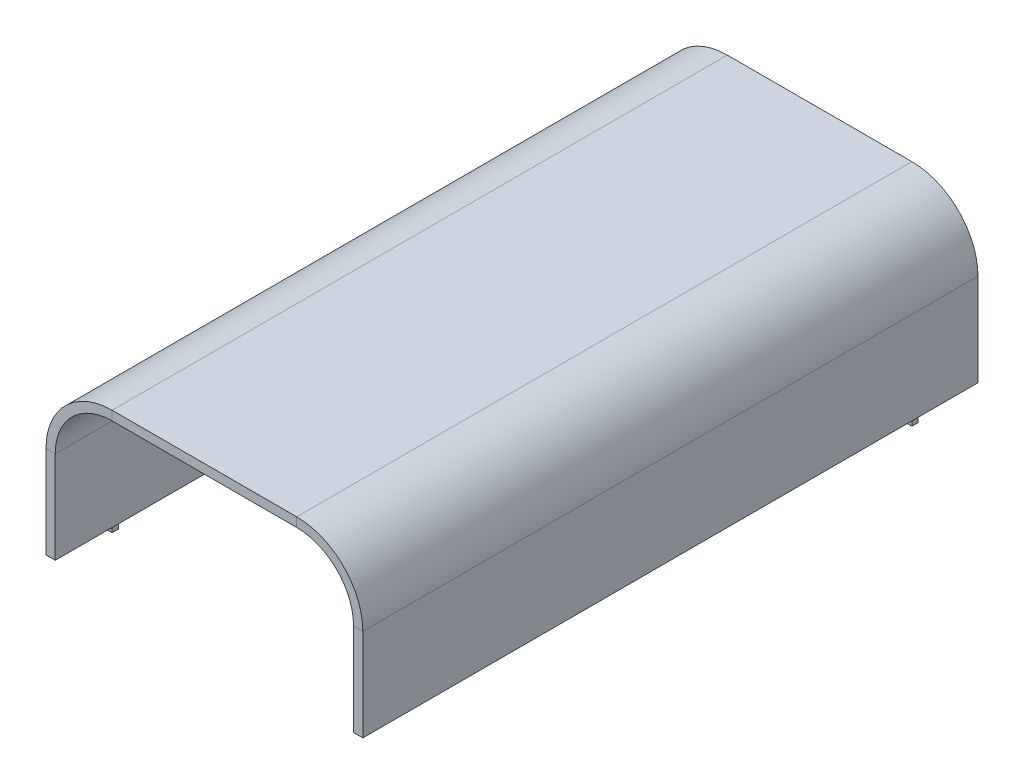
ISO-10303-21;
HEADER;
FILE_DESCRIPTION(('STEP AP214'),'2;1');
FILE_NAME('part.step','',(''),(''),'','','');
FILE_SCHEMA(('AUTOMOTIVE_DESIGN { 1 0 10303 214 1 1 1 1 }'));
ENDSEC;
DATA;
#1=APPLICATION_CONTEXT('core data for automotive mechanical design processes');
#2=APPLICATION_PROTOCOL_DEFINITION('international standard','automotive_design',2000,#1);
#3=PRODUCT_CONTEXT('',#1,'mechanical');
#4=PRODUCT('Part','Part','',(#3));
#5=PRODUCT_RELATED_PRODUCT_CATEGORY('part','',(#4));
#6=PRODUCT_DEFINITION_FORMATION('','',#4);
#7=PRODUCT_DEFINITION_CONTEXT('part definition',#1,'design');
#8=PRODUCT_DEFINITION('design','',#6,#7);
#9=PRODUCT_DEFINITION_SHAPE('','',#8);
#10=(LENGTH_UNIT() NAMED_UNIT(*) SI_UNIT(.MILLI.,.METRE.));
#11=(NAMED_UNIT(*) PLANE_ANGLE_UNIT() SI_UNIT($,.RADIAN.));
#12=(NAMED_UNIT(*) SI_UNIT($,.STERADIAN.) SOLID_ANGLE_UNIT());
#13=UNCERTAINTY_MEASURE_WITH_UNIT(LENGTH_MEASURE(1.E-05),#10,'distance_accuracy_value','');
#14=(GEOMETRIC_REPRESENTATION_CONTEXT(3) GLOBAL_UNCERTAINTY_ASSIGNED_CONTEXT((#13)) GLOBAL_UNIT_ASSIGNED_CONTEXT((#10,
#11,#12)) REPRESENTATION_CONTEXT('',''));
#15=CARTESIAN_POINT('',(0.,0.,0.));
#16=DIRECTION('',(0.,0.,1.));
#17=DIRECTION('',(1.,0.,0.));
#18=AXIS2_PLACEMENT_3D('',#15,#16,#17);
#19=CARTESIAN_POINT('',(0.,0.,0.));
#20=DIRECTION('',(0.,-1.,0.));
#21=DIRECTION('',(0.,0.,-1.));
#22=AXIS2_PLACEMENT_3D('',#19,#20,#21);
#23=PLANE('',#22);
#24=DIRECTION('',(0.,0.,-1.));
#25=VECTOR('',#24,1.);
#26=CARTESIAN_POINT('',(-244.999999999999,0.,-6.80011602582912E-13));
#27=LINE('',#26,#25);
#28=CARTESIAN_POINT('',(-245.,0.,405.));
#29=VERTEX_POINT('',#28);
#30=CARTESIAN_POINT('',(-245.,0.,395.));
#31=VERTEX_POINT('',#30);
#32=EDGE_CURVE('E315',#29,#31,#27,.T.);
#33=ORIENTED_EDGE('',*,*,#32,.T.);
#34=DIRECTION('',(1.,0.,0.));
#35=VECTOR('',#34,1.);
#36=CARTESIAN_POINT('',(0.,0.,395.));
#37=LINE('',#36,#35);
#38=CARTESIAN_POINT('',(-255.,0.,395.));
#39=VERTEX_POINT('',#38);
#40=EDGE_CURVE('E320',#39,#31,#37,.T.);
#41=ORIENTED_EDGE('',*,*,#40,.F.);
#42=DIRECTION('',(0.,0.,-1.));
#43=VECTOR('',#42,1.);
#44=CARTESIAN_POINT('',(-255.,0.,0.));
#45=LINE('',#44,#43);
#46=CARTESIAN_POINT('',(-255.,0.,405.));
#47=VERTEX_POINT('',#46);
#48=EDGE_CURVE('E333',#47,#39,#45,.T.);
#49=ORIENTED_EDGE('',*,*,#48,.F.);
#50=DIRECTION('',(1.,0.,0.));
#51=VECTOR('',#50,1.);
#52=CARTESIAN_POINT('',(0.,0.,405.));
#53=LINE('',#52,#51);
#54=EDGE_CURVE('E330',#47,#29,#53,.T.);
#55=ORIENTED_EDGE('',*,*,#54,.T.);
#56=EDGE_LOOP('',(#33,#41,#49,#55));
#57=FACE_BOUND('',#56,.T.);
#58=DIRECTION('',(0.,0.,-1.));
#59=VECTOR('',#58,1.);
#60=CARTESIAN_POINT('',(-242.5,0.,499.999999999999));
#61=LINE('',#60,#59);
#62=CARTESIAN_POINT('',(-242.5,0.,499.999999999999));
#63=VERTEX_POINT('',#62);
#64=CARTESIAN_POINT('',(-242.5,0.,-500.000000000001));
#65=VERTEX_POINT('',#64);
#66=EDGE_CURVE('E345',#63,#65,#61,.T.);
#67=ORIENTED_EDGE('',*,*,#66,.F.);
#68=DIRECTION('',(1.,0.,0.));
#69=VECTOR('',#68,1.);
#70=CARTESIAN_POINT('',(-257.5,0.,499.999999999999));
#71=LINE('',#70,#69);
#72=CARTESIAN_POINT('',(-257.5,0.,499.999999999999));
#73=VERTEX_POINT('',#72);
#74=EDGE_CURVE('E359',#73,#63,#71,.T.);
#75=ORIENTED_EDGE('',*,*,#74,.F.);
#76=DIRECTION('',(0.,0.,1.));
#77=VECTOR('',#76,1.);
#78=CARTESIAN_POINT('',(-257.5,0.,499.999999999999));
#79=LINE('',#78,#77);
#80=CARTESIAN_POINT('',(-257.5,0.,-500.000000000001));
#81=VERTEX_POINT('',#80);
#82=EDGE_CURVE('E405',#81,#73,#79,.T.);
#83=ORIENTED_EDGE('',*,*,#82,.F.);
#84=DIRECTION('',(-1.,0.,0.));
#85=VECTOR('',#84,1.);
#86=CARTESIAN_POINT('',(-257.5,0.,-500.000000000001));
#87=LINE('',#86,#85);
#88=EDGE_CURVE('E348',#65,#81,#87,.T.);
#89=ORIENTED_EDGE('',*,*,#88,.F.);
#90=EDGE_LOOP('',(#67,#75,#83,#89));
#91=FACE_BOUND('',#90,.T.);
#92=DIRECTION('',(1.,0.,0.));
#93=VECTOR('',#92,1.);
#94=CARTESIAN_POINT('',(0.,0.,-395.));
#95=LINE('',#94,#93);
#96=CARTESIAN_POINT('',(-255.,0.,-395.));
#97=VERTEX_POINT('',#96);
#98=CARTESIAN_POINT('',(-245.,0.,-395.));
#99=VERTEX_POINT('',#98);
#100=EDGE_CURVE('E246',#97,#99,#95,.T.);
#101=ORIENTED_EDGE('',*,*,#100,.T.);
#102=DIRECTION('',(0.,0.,-1.));
#103=VECTOR('',#102,1.);
#104=CARTESIAN_POINT('',(-245.000000000001,0.,-6.80011602582915E-13));
#105=LINE('',#104,#103);
#106=CARTESIAN_POINT('',(-245.,0.,-405.));
#107=VERTEX_POINT('',#106);
#108=EDGE_CURVE('E48',#99,#107,#105,.T.);
#109=ORIENTED_EDGE('',*,*,#108,.T.);
#110=DIRECTION('',(1.,0.,0.));
#111=VECTOR('',#110,1.);
#112=CARTESIAN_POINT('',(0.,0.,-405.));
#113=LINE('',#112,#111);
#114=CARTESIAN_POINT('',(-255.,0.,-405.));
#115=VERTEX_POINT('',#114);
#116=EDGE_CURVE('E237',#115,#107,#113,.T.);
#117=ORIENTED_EDGE('',*,*,#116,.F.);
#118=DIRECTION('',(0.,0.,-1.));
#119=VECTOR('',#118,1.);
#120=CARTESIAN_POINT('',(-255.,0.,0.));
#121=LINE('',#120,#119);
#122=EDGE_CURVE('E240',#97,#115,#121,.T.);
#123=ORIENTED_EDGE('',*,*,#122,.F.);
#124=EDGE_LOOP('',(#101,#109,#117,#123));
#125=FACE_BOUND('',#124,.T.);
#126=ADVANCED_FACE('F34',(#57,#91,#125),#23,.T.);
#127=CARTESIAN_POINT('',(0.,0.,0.));
#128=DIRECTION('',(0.,1.,0.));
#129=DIRECTION('',(0.,0.,-1.));
#130=AXIS2_PLACEMENT_3D('',#127,#128,#129);
#131=PLANE('',#130);
#132=DIRECTION('',(1.,0.,0.));
#133=VECTOR('',#132,1.);
#134=CARTESIAN_POINT('',(245.,0.,395.));
#135=LINE('',#134,#133);
#136=CARTESIAN_POINT('',(245.,0.,395.));
#137=VERTEX_POINT('',#136);
#138=CARTESIAN_POINT('',(255.,0.,395.));
#139=VERTEX_POINT('',#138);
#140=EDGE_CURVE('E272',#137,#139,#135,.T.);
#141=ORIENTED_EDGE('',*,*,#140,.F.);
#142=DIRECTION('',(0.,0.,-1.));
#143=VECTOR('',#142,1.);
#144=CARTESIAN_POINT('',(245.,0.,405.));
#145=LINE('',#144,#143);
#146=CARTESIAN_POINT('',(245.,0.,405.));
#147=VERTEX_POINT('',#146);
#148=EDGE_CURVE('E56',#147,#137,#145,.T.);
#149=ORIENTED_EDGE('',*,*,#148,.F.);
#150=DIRECTION('',(1.,0.,0.));
#151=VECTOR('',#150,1.);
#152=CARTESIAN_POINT('',(245.,0.,405.));
#153=LINE('',#152,#151);
#154=CARTESIAN_POINT('',(255.,0.,405.));
#155=VERTEX_POINT('',#154);
#156=EDGE_CURVE('E265',#147,#155,#153,.T.);
#157=ORIENTED_EDGE('',*,*,#156,.T.);
#158=DIRECTION('',(0.,0.,-1.));
#159=VECTOR('',#158,1.);
#160=CARTESIAN_POINT('',(255.,0.,405.));
#161=LINE('',#160,#159);
#162=EDGE_CURVE('E268',#155,#139,#161,.T.);
#163=ORIENTED_EDGE('',*,*,#162,.T.);
#164=EDGE_LOOP('',(#141,#149,#157,#163));
#165=FACE_BOUND('',#164,.T.);
#166=DIRECTION('',(1.,0.,0.));
#167=VECTOR('',#166,1.);
#168=CARTESIAN_POINT('',(0.,0.,-395.));
#169=LINE('',#168,#167);
#170=CARTESIAN_POINT('',(245.,0.,-395.));
#171=VERTEX_POINT('',#170);
#172=CARTESIAN_POINT('',(255.,0.,-395.));
#173=VERTEX_POINT('',#172);
#174=EDGE_CURVE('E297',#171,#173,#169,.T.);
#175=ORIENTED_EDGE('',*,*,#174,.T.);
#176=DIRECTION('',(0.,0.,-1.));
#177=VECTOR('',#176,1.);
#178=CARTESIAN_POINT('',(255.,0.,0.));
#179=LINE('',#178,#177);
#180=CARTESIAN_POINT('',(255.,0.,-405.));
#181=VERTEX_POINT('',#180);
#182=EDGE_CURVE('E252',#173,#181,#179,.T.);
#183=ORIENTED_EDGE('',*,*,#182,.T.);
#184=DIRECTION('',(1.,0.,0.));
#185=VECTOR('',#184,1.);
#186=CARTESIAN_POINT('',(0.,0.,-405.));
#187=LINE('',#186,#185);
#188=CARTESIAN_POINT('',(245.,0.,-405.));
#189=VERTEX_POINT('',#188);
#190=EDGE_CURVE('E288',#189,#181,#187,.T.);
#191=ORIENTED_EDGE('',*,*,#190,.F.);
#192=DIRECTION('',(0.,0.,-1.));
#193=VECTOR('',#192,1.);
#194=CARTESIAN_POINT('',(245.,0.,0.));
#195=LINE('',#194,#193);
#196=EDGE_CURVE('E299',#171,#189,#195,.T.);
#197=ORIENTED_EDGE('',*,*,#196,.F.);
#198=EDGE_LOOP('',(#175,#183,#191,#197));
#199=FACE_BOUND('',#198,.T.);
#200=DIRECTION('',(0.,0.,-1.));
#201=VECTOR('',#200,1.);
#202=CARTESIAN_POINT('',(242.5,0.,499.999999999999));
#203=LINE('',#202,#201);
#204=CARTESIAN_POINT('',(242.5,0.,499.999999999999));
#205=VERTEX_POINT('',#204);
#206=CARTESIAN_POINT('',(242.5,0.,-500.000000000001));
#207=VERTEX_POINT('',#206);
#208=EDGE_CURVE('E393',#205,#207,#203,.T.);
#209=ORIENTED_EDGE('',*,*,#208,.T.);
#210=DIRECTION('',(1.,0.,0.));
#211=VECTOR('',#210,1.);
#212=CARTESIAN_POINT('',(257.5,0.,-500.000000000001));
#213=LINE('',#212,#211);
#214=CARTESIAN_POINT('',(257.5,0.,-500.000000000001));
#215=VERTEX_POINT('',#214);
#216=EDGE_CURVE('E399',#207,#215,#213,.T.);
#217=ORIENTED_EDGE('',*,*,#216,.T.);
#218=DIRECTION('',(0.,0.,1.));
#219=VECTOR('',#218,1.);
#220=CARTESIAN_POINT('',(257.5,0.,499.999999999999));
#221=LINE('',#220,#219);
#222=CARTESIAN_POINT('',(257.5,0.,499.999999999999));
#223=VERTEX_POINT('',#222);
#224=EDGE_CURVE('E434',#215,#223,#221,.T.);
#225=ORIENTED_EDGE('',*,*,#224,.T.);
#226=DIRECTION('',(-1.,0.,0.));
#227=VECTOR('',#226,1.);
#228=CARTESIAN_POINT('',(257.5,0.,499.999999999999));
#229=LINE('',#228,#227);
#230=EDGE_CURVE('E11',#223,#205,#229,.T.);
#231=ORIENTED_EDGE('',*,*,#230,.T.);
#232=EDGE_LOOP('',(#209,#217,#225,#231));
#233=FACE_BOUND('',#232,.T.);
#234=ADVANCED_FACE('F523',(#165,#199,#233),#131,.F.);
#235=CARTESIAN_POINT('',(-242.5,0.,499.999999999999));
#236=DIRECTION('',(1.,0.,0.));
#237=DIRECTION('',(0.,0.,-1.));
#238=AXIS2_PLACEMENT_3D('',#235,#236,#237);
#239=PLANE('',#238);
#240=DIRECTION('',(0.,1.,0.));
#241=VECTOR('',#240,1.);
#242=CARTESIAN_POINT('',(-242.5,0.,-500.000000000001));
#243=LINE('',#242,#241);
#244=CARTESIAN_POINT('',(-242.5,149.999999999999,-500.000000000001));
#245=VERTEX_POINT('',#244);
#246=EDGE_CURVE('E352',#65,#245,#243,.T.);
#247=ORIENTED_EDGE('',*,*,#246,.T.);
#248=DIRECTION('',(0.,0.,-1.));
#249=VECTOR('',#248,1.);
#250=CARTESIAN_POINT('',(-242.5,149.999999999999,499.999999999999));
#251=LINE('',#250,#249);
#252=CARTESIAN_POINT('',(-242.5,149.999999999999,499.999999999999));
#253=VERTEX_POINT('',#252);
#254=EDGE_CURVE('E349',#253,#245,#251,.T.);
#255=ORIENTED_EDGE('',*,*,#254,.F.);
#256=DIRECTION('',(0.,1.,0.));
#257=VECTOR('',#256,1.);
#258=CARTESIAN_POINT('',(-242.5,0.,499.999999999999));
#259=LINE('',#258,#257);
#260=EDGE_CURVE('E353',#63,#253,#259,.T.);
#261=ORIENTED_EDGE('',*,*,#260,.F.);
#262=ORIENTED_EDGE('',*,*,#66,.T.);
#263=EDGE_LOOP('',(#247,#255,#261,#262));
#264=FACE_BOUND('',#263,.T.);
#265=ADVANCED_FACE('F496',(#264),#239,.T.);
#266=CARTESIAN_POINT('',(-257.5,0.,-500.000000000001));
#267=DIRECTION('',(0.,0.,-1.));
#268=DIRECTION('',(-1.,0.,0.));
#269=AXIS2_PLACEMENT_3D('',#266,#267,#268);
#270=PLANE('',#269);
#271=DIRECTION('',(0.,1.,0.));
#272=VECTOR('',#271,1.);
#273=CARTESIAN_POINT('',(-257.5,0.,-500.000000000001));
#274=LINE('',#273,#272);
#275=CARTESIAN_POINT('',(-257.5,149.999999999999,-500.000000000001));
#276=VERTEX_POINT('',#275);
#277=EDGE_CURVE('E408',#81,#276,#274,.T.);
#278=ORIENTED_EDGE('',*,*,#277,.T.);
#279=DIRECTION('',(-1.,0.,0.));
#280=VECTOR('',#279,1.);
#281=CARTESIAN_POINT('',(-257.5,149.999999999999,-500.000000000001));
#282=LINE('',#281,#280);
#283=EDGE_CURVE('E356',#245,#276,#282,.T.);
#284=ORIENTED_EDGE('',*,*,#283,.F.);
#285=ORIENTED_EDGE('',*,*,#246,.F.);
#286=ORIENTED_EDGE('',*,*,#88,.T.);
#287=EDGE_LOOP('',(#278,#284,#285,#286));
#288=FACE_BOUND('',#287,.T.);
#289=ADVANCED_FACE('F507',(#288),#270,.T.);
#290=CARTESIAN_POINT('',(-257.5,0.,499.999999999999));
#291=DIRECTION('',(-1.,0.,0.));
#292=DIRECTION('',(0.,0.,1.));
#293=AXIS2_PLACEMENT_3D('',#290,#291,#292);
#294=PLANE('',#293);
#295=DIRECTION('',(0.,1.,0.));
#296=VECTOR('',#295,1.);
#297=CARTESIAN_POINT('',(-257.5,0.,499.999999999999));
#298=LINE('',#297,#296);
#299=CARTESIAN_POINT('',(-257.5,149.999999999999,499.999999999999));
#300=VERTEX_POINT('',#299);
#301=EDGE_CURVE('E439',#73,#300,#298,.T.);
#302=ORIENTED_EDGE('',*,*,#301,.T.);
#303=DIRECTION('',(0.,0.,1.));
#304=VECTOR('',#303,1.);
#305=CARTESIAN_POINT('',(-257.5,149.999999999999,499.999999999999));
#306=LINE('',#305,#304);
#307=EDGE_CURVE('E411',#276,#300,#306,.T.);
#308=ORIENTED_EDGE('',*,*,#307,.F.);
#309=ORIENTED_EDGE('',*,*,#277,.F.);
#310=ORIENTED_EDGE('',*,*,#82,.T.);
#311=EDGE_LOOP('',(#302,#308,#309,#310));
#312=FACE_BOUND('',#311,.T.);
#313=ADVANCED_FACE('F503',(#312),#294,.T.);
#314=CARTESIAN_POINT('',(-257.5,0.,499.999999999999));
#315=DIRECTION('',(0.,0.,1.));
#316=DIRECTION('',(1.,0.,0.));
#317=AXIS2_PLACEMENT_3D('',#314,#315,#316);
#318=PLANE('',#317);
#319=DIRECTION('',(1.,0.,0.));
#320=VECTOR('',#319,1.);
#321=CARTESIAN_POINT('',(-257.5,149.999999999999,499.999999999999));
#322=LINE('',#321,#320);
#323=EDGE_CURVE('E370',#300,#253,#322,.T.);
#324=ORIENTED_EDGE('',*,*,#323,.F.);
#325=ORIENTED_EDGE('',*,*,#301,.F.);
#326=ORIENTED_EDGE('',*,*,#74,.T.);
#327=ORIENTED_EDGE('',*,*,#260,.T.);
#328=EDGE_LOOP('',(#324,#325,#326,#327));
#329=FACE_BOUND('',#328,.T.);
#330=ADVANCED_FACE('F498',(#329),#318,.T.);
#331=CARTESIAN_POINT('',(-150.,150.,0.));
#332=DIRECTION('',(0.,0.,-1.));
#333=DIRECTION('',(-1.,0.,0.));
#334=AXIS2_PLACEMENT_3D('',#331,#332,#333);
#335=CYLINDRICAL_SURFACE('',#334,92.5);
#336=CARTESIAN_POINT('',(-150.,150.,-500.000000000001));
#337=DIRECTION('',(0.,0.,-1.));
#338=DIRECTION('',(-1.,0.,0.));
#339=AXIS2_PLACEMENT_3D('',#336,#337,#338);
#340=CIRCLE('',#339,92.5);
#341=CARTESIAN_POINT('',(-149.999999999999,242.5,-500.000000000001));
#342=VERTEX_POINT('',#341);
#343=EDGE_CURVE('E363',#245,#342,#340,.T.);
#344=ORIENTED_EDGE('',*,*,#343,.T.);
#345=DIRECTION('',(0.,0.,-1.));
#346=VECTOR('',#345,1.);
#347=CARTESIAN_POINT('',(-149.999999999999,242.5,499.999999999999));
#348=LINE('',#347,#346);
#349=CARTESIAN_POINT('',(-149.999999999999,242.5,499.999999999999));
#350=VERTEX_POINT('',#349);
#351=EDGE_CURVE('E360',#350,#342,#348,.T.);
#352=ORIENTED_EDGE('',*,*,#351,.F.);
#353=CARTESIAN_POINT('',(-150.,150.,499.999999999999));
#354=DIRECTION('',(0.,0.,-1.));
#355=DIRECTION('',(-1.,0.,0.));
#356=AXIS2_PLACEMENT_3D('',#353,#354,#355);
#357=CIRCLE('',#356,92.5);
#358=EDGE_CURVE('E364',#253,#350,#357,.T.);
#359=ORIENTED_EDGE('',*,*,#358,.F.);
#360=ORIENTED_EDGE('',*,*,#254,.T.);
#361=EDGE_LOOP('',(#344,#352,#359,#360));
#362=FACE_BOUND('',#361,.T.);
#363=ADVANCED_FACE('F488',(#362),#335,.F.);
#364=CARTESIAN_POINT('',(-257.5,150.000000000001,-500.000000000001));
#365=DIRECTION('',(0.,0.,-1.));
#366=DIRECTION('',(-1.,0.,0.));
#367=AXIS2_PLACEMENT_3D('',#364,#365,#366);
#368=PLANE('',#367);
#369=CARTESIAN_POINT('',(-150.,150.,-500.000000000001));
#370=DIRECTION('',(0.,0.,-1.));
#371=DIRECTION('',(-1.,0.,0.));
#372=AXIS2_PLACEMENT_3D('',#369,#370,#371);
#373=CIRCLE('',#372,107.5);
#374=CARTESIAN_POINT('',(-149.999999999999,257.5,-500.000000000001));
#375=VERTEX_POINT('',#374);
#376=EDGE_CURVE('E414',#276,#375,#373,.T.);
#377=ORIENTED_EDGE('',*,*,#376,.T.);
#378=DIRECTION('',(0.,1.,0.));
#379=VECTOR('',#378,1.);
#380=CARTESIAN_POINT('',(-149.999999999999,257.5,-500.000000000001));
#381=LINE('',#380,#379);
#382=EDGE_CURVE('E367',#342,#375,#381,.T.);
#383=ORIENTED_EDGE('',*,*,#382,.F.);
#384=ORIENTED_EDGE('',*,*,#343,.F.);
#385=ORIENTED_EDGE('',*,*,#283,.T.);
#386=EDGE_LOOP('',(#377,#383,#384,#385));
#387=FACE_BOUND('',#386,.T.);
#388=ADVANCED_FACE('F509',(#387),#368,.T.);
#389=CARTESIAN_POINT('',(-150.,150.,0.));
#390=DIRECTION('',(0.,0.,-1.));
#391=DIRECTION('',(-1.,0.,0.));
#392=AXIS2_PLACEMENT_3D('',#389,#390,#391);
#393=CYLINDRICAL_SURFACE('',#392,107.5);
#394=CARTESIAN_POINT('',(-150.,150.,499.999999999999));
#395=DIRECTION('',(0.,0.,-1.));
#396=DIRECTION('',(-1.,0.,0.));
#397=AXIS2_PLACEMENT_3D('',#394,#395,#396);
#398=CIRCLE('',#397,107.5);
#399=CARTESIAN_POINT('',(-149.999999999999,257.5,499.999999999999));
#400=VERTEX_POINT('',#399);
#401=EDGE_CURVE('E444',#300,#400,#398,.T.);
#402=ORIENTED_EDGE('',*,*,#401,.T.);
#403=DIRECTION('',(0.,0.,1.));
#404=VECTOR('',#403,1.);
#405=CARTESIAN_POINT('',(-149.999999999999,257.5,499.999999999999));
#406=LINE('',#405,#404);
#407=EDGE_CURVE('E417',#375,#400,#406,.T.);
#408=ORIENTED_EDGE('',*,*,#407,.F.);
#409=ORIENTED_EDGE('',*,*,#376,.F.);
#410=ORIENTED_EDGE('',*,*,#307,.T.);
#411=EDGE_LOOP('',(#402,#408,#409,#410));
#412=FACE_BOUND('',#411,.T.);
#413=ADVANCED_FACE('F535',(#412),#393,.T.);
#414=CARTESIAN_POINT('',(-257.5,150.000000000001,499.999999999999));
#415=DIRECTION('',(0.,0.,1.));
#416=DIRECTION('',(1.,0.,0.));
#417=AXIS2_PLACEMENT_3D('',#414,#415,#416);
#418=PLANE('',#417);
#419=DIRECTION('',(0.,-1.,0.));
#420=VECTOR('',#419,1.);
#421=CARTESIAN_POINT('',(-149.999999999999,257.5,499.999999999999));
#422=LINE('',#421,#420);
#423=EDGE_CURVE('E381',#400,#350,#422,.T.);
#424=ORIENTED_EDGE('',*,*,#423,.F.);
#425=ORIENTED_EDGE('',*,*,#401,.F.);
#426=ORIENTED_EDGE('',*,*,#323,.T.);
#427=ORIENTED_EDGE('',*,*,#358,.T.);
#428=EDGE_LOOP('',(#424,#425,#426,#427));
#429=FACE_BOUND('',#428,.T.);
#430=ADVANCED_FACE('F489',(#429),#418,.T.);
#431=CARTESIAN_POINT('',(-149.999999999999,242.5,499.999999999999));
#432=DIRECTION('',(0.,-1.,0.));
#433=DIRECTION('',(1.,0.,0.));
#434=AXIS2_PLACEMENT_3D('',#431,#432,#433);
#435=PLANE('',#434);
#436=DIRECTION('',(1.,0.,0.));
#437=VECTOR('',#436,1.);
#438=CARTESIAN_POINT('',(-149.999999999999,242.5,-500.000000000001));
#439=LINE('',#438,#437);
#440=CARTESIAN_POINT('',(149.999999999999,242.5,-500.000000000001));
#441=VERTEX_POINT('',#440);
#442=EDGE_CURVE('E374',#342,#441,#439,.T.);
#443=ORIENTED_EDGE('',*,*,#442,.T.);
#444=DIRECTION('',(0.,0.,-1.));
#445=VECTOR('',#444,1.);
#446=CARTESIAN_POINT('',(149.999999999999,242.5,499.999999999999));
#447=LINE('',#446,#445);
#448=CARTESIAN_POINT('',(149.999999999999,242.5,499.999999999999));
#449=VERTEX_POINT('',#448);
#450=EDGE_CURVE('E371',#449,#441,#447,.T.);
#451=ORIENTED_EDGE('',*,*,#450,.F.);
#452=DIRECTION('',(1.,0.,0.));
#453=VECTOR('',#452,1.);
#454=CARTESIAN_POINT('',(-149.999999999999,242.5,499.999999999999));
#455=LINE('',#454,#453);
#456=EDGE_CURVE('E375',#350,#449,#455,.T.);
#457=ORIENTED_EDGE('',*,*,#456,.F.);
#458=ORIENTED_EDGE('',*,*,#351,.T.);
#459=EDGE_LOOP('',(#443,#451,#457,#458));
#460=FACE_BOUND('',#459,.T.);
#461=ADVANCED_FACE('F482',(#460),#435,.T.);
#462=CARTESIAN_POINT('',(-149.999999999999,257.5,-500.000000000001));
#463=DIRECTION('',(0.,0.,-1.));
#464=DIRECTION('',(-1.,0.,0.));
#465=AXIS2_PLACEMENT_3D('',#462,#463,#464);
#466=PLANE('',#465);
#467=DIRECTION('',(1.,0.,0.));
#468=VECTOR('',#467,1.);
#469=CARTESIAN_POINT('',(-149.999999999999,257.5,-500.000000000001));
#470=LINE('',#469,#468);
#471=CARTESIAN_POINT('',(149.999999999999,257.5,-500.000000000001));
#472=VERTEX_POINT('',#471);
#473=EDGE_CURVE('E420',#375,#472,#470,.T.);
#474=ORIENTED_EDGE('',*,*,#473,.T.);
#475=DIRECTION('',(0.,1.,0.));
#476=VECTOR('',#475,1.);
#477=CARTESIAN_POINT('',(149.999999999999,257.5,-500.000000000001));
#478=LINE('',#477,#476);
#479=EDGE_CURVE('E378',#441,#472,#478,.T.);
#480=ORIENTED_EDGE('',*,*,#479,.F.);
#481=ORIENTED_EDGE('',*,*,#442,.F.);
#482=ORIENTED_EDGE('',*,*,#382,.T.);
#483=EDGE_LOOP('',(#474,#480,#481,#482));
#484=FACE_BOUND('',#483,.T.);
#485=ADVANCED_FACE('F512',(#484),#466,.T.);
#486=CARTESIAN_POINT('',(-149.999999999999,257.5,499.999999999999));
#487=DIRECTION('',(0.,1.,0.));
#488=DIRECTION('',(-1.,0.,0.));
#489=AXIS2_PLACEMENT_3D('',#486,#487,#488);
#490=PLANE('',#489);
#491=DIRECTION('',(1.,0.,0.));
#492=VECTOR('',#491,1.);
#493=CARTESIAN_POINT('',(-149.999999999999,257.5,499.999999999999));
#494=LINE('',#493,#492);
#495=CARTESIAN_POINT('',(149.999999999999,257.5,499.999999999999));
#496=VERTEX_POINT('',#495);
#497=EDGE_CURVE('E449',#400,#496,#494,.T.);
#498=ORIENTED_EDGE('',*,*,#497,.T.);
#499=DIRECTION('',(0.,0.,1.));
#500=VECTOR('',#499,1.);
#501=CARTESIAN_POINT('',(149.999999999999,257.5,499.999999999999));
#502=LINE('',#501,#500);
#503=EDGE_CURVE('E423',#472,#496,#502,.T.);
#504=ORIENTED_EDGE('',*,*,#503,.F.);
#505=ORIENTED_EDGE('',*,*,#473,.F.);
#506=ORIENTED_EDGE('',*,*,#407,.T.);
#507=EDGE_LOOP('',(#498,#504,#505,#506));
#508=FACE_BOUND('',#507,.T.);
#509=ADVANCED_FACE('F532',(#508),#490,.T.);
#510=CARTESIAN_POINT('',(-149.999999999999,257.5,499.999999999999));
#511=DIRECTION('',(0.,0.,1.));
#512=DIRECTION('',(1.,0.,0.));
#513=AXIS2_PLACEMENT_3D('',#510,#511,#512);
#514=PLANE('',#513);
#515=DIRECTION('',(0.,-1.,0.));
#516=VECTOR('',#515,1.);
#517=CARTESIAN_POINT('',(149.999999999999,257.5,499.999999999999));
#518=LINE('',#517,#516);
#519=EDGE_CURVE('E392',#496,#449,#518,.T.);
#520=ORIENTED_EDGE('',*,*,#519,.F.);
#521=ORIENTED_EDGE('',*,*,#497,.F.);
#522=ORIENTED_EDGE('',*,*,#423,.T.);
#523=ORIENTED_EDGE('',*,*,#456,.T.);
#524=EDGE_LOOP('',(#520,#521,#522,#523));
#525=FACE_BOUND('',#524,.T.);
#526=ADVANCED_FACE('F483',(#525),#514,.T.);
#527=CARTESIAN_POINT('',(150.,150.,0.));
#528=DIRECTION('',(0.,0.,-1.));
#529=DIRECTION('',(-1.,0.,0.));
#530=AXIS2_PLACEMENT_3D('',#527,#528,#529);
#531=CYLINDRICAL_SURFACE('',#530,92.5);
#532=CARTESIAN_POINT('',(150.,150.,-500.000000000001));
#533=DIRECTION('',(0.,0.,-1.));
#534=DIRECTION('',(0.,1.,0.));
#535=AXIS2_PLACEMENT_3D('',#532,#533,#534);
#536=CIRCLE('',#535,92.5);
#537=CARTESIAN_POINT('',(242.5,149.999999999999,-500.000000000001));
#538=VERTEX_POINT('',#537);
#539=EDGE_CURVE('E385',#441,#538,#536,.T.);
#540=ORIENTED_EDGE('',*,*,#539,.T.);
#541=DIRECTION('',(0.,0.,-1.));
#542=VECTOR('',#541,1.);
#543=CARTESIAN_POINT('',(242.5,149.999999999999,499.999999999999));
#544=LINE('',#543,#542);
#545=CARTESIAN_POINT('',(242.5,149.999999999999,499.999999999999));
#546=VERTEX_POINT('',#545);
#547=EDGE_CURVE('E382',#546,#538,#544,.T.);
#548=ORIENTED_EDGE('',*,*,#547,.F.);
#549=CARTESIAN_POINT('',(150.,150.,499.999999999999));
#550=DIRECTION('',(0.,0.,-1.));
#551=DIRECTION('',(0.,1.,0.));
#552=AXIS2_PLACEMENT_3D('',#549,#550,#551);
#553=CIRCLE('',#552,92.5);
#554=EDGE_CURVE('E386',#449,#546,#553,.T.);
#555=ORIENTED_EDGE('',*,*,#554,.F.);
#556=ORIENTED_EDGE('',*,*,#450,.T.);
#557=EDGE_LOOP('',(#540,#548,#555,#556));
#558=FACE_BOUND('',#557,.T.);
#559=ADVANCED_FACE('F475',(#558),#531,.F.);
#560=CARTESIAN_POINT('',(149.999999999999,257.5,-500.000000000001));
#561=DIRECTION('',(0.,0.,-1.));
#562=DIRECTION('',(-1.,0.,0.));
#563=AXIS2_PLACEMENT_3D('',#560,#561,#562);
#564=PLANE('',#563);
#565=CARTESIAN_POINT('',(150.,150.,-500.000000000001));
#566=DIRECTION('',(0.,0.,-1.));
#567=DIRECTION('',(0.,1.,0.));
#568=AXIS2_PLACEMENT_3D('',#565,#566,#567);
#569=CIRCLE('',#568,107.5);
#570=CARTESIAN_POINT('',(257.5,149.999999999999,-500.000000000001));
#571=VERTEX_POINT('',#570);
#572=EDGE_CURVE('E426',#472,#571,#569,.T.);
#573=ORIENTED_EDGE('',*,*,#572,.T.);
#574=DIRECTION('',(1.,0.,0.));
#575=VECTOR('',#574,1.);
#576=CARTESIAN_POINT('',(257.5,149.999999999999,-500.000000000001));
#577=LINE('',#576,#575);
#578=EDGE_CURVE('E389',#538,#571,#577,.T.);
#579=ORIENTED_EDGE('',*,*,#578,.F.);
#580=ORIENTED_EDGE('',*,*,#539,.F.);
#581=ORIENTED_EDGE('',*,*,#479,.T.);
#582=EDGE_LOOP('',(#573,#579,#580,#581));
#583=FACE_BOUND('',#582,.T.);
#584=ADVANCED_FACE('F515',(#583),#564,.T.);
#585=CARTESIAN_POINT('',(150.,150.,0.));
#586=DIRECTION('',(0.,0.,-1.));
#587=DIRECTION('',(-1.,0.,0.));
#588=AXIS2_PLACEMENT_3D('',#585,#586,#587);
#589=CYLINDRICAL_SURFACE('',#588,107.5);
#590=CARTESIAN_POINT('',(150.,150.,499.999999999999));
#591=DIRECTION('',(0.,0.,-1.));
#592=DIRECTION('',(0.,1.,0.));
#593=AXIS2_PLACEMENT_3D('',#590,#591,#592);
#594=CIRCLE('',#593,107.5);
#595=CARTESIAN_POINT('',(257.5,149.999999999999,499.999999999999));
#596=VERTEX_POINT('',#595);
#597=EDGE_CURVE('E454',#496,#596,#594,.T.);
#598=ORIENTED_EDGE('',*,*,#597,.T.);
#599=DIRECTION('',(0.,0.,1.));
#600=VECTOR('',#599,1.);
#601=CARTESIAN_POINT('',(257.5,149.999999999999,499.999999999999));
#602=LINE('',#601,#600);
#603=EDGE_CURVE('E429',#571,#596,#602,.T.);
#604=ORIENTED_EDGE('',*,*,#603,.F.);
#605=ORIENTED_EDGE('',*,*,#572,.F.);
#606=ORIENTED_EDGE('',*,*,#503,.T.);
#607=EDGE_LOOP('',(#598,#604,#605,#606));
#608=FACE_BOUND('',#607,.T.);
#609=ADVANCED_FACE('F529',(#608),#589,.T.);
#610=CARTESIAN_POINT('',(149.999999999999,257.5,499.999999999999));
#611=DIRECTION('',(0.,0.,1.));
#612=DIRECTION('',(1.,0.,0.));
#613=AXIS2_PLACEMENT_3D('',#610,#611,#612);
#614=PLANE('',#613);
#615=DIRECTION('',(-1.,0.,0.));
#616=VECTOR('',#615,1.);
#617=CARTESIAN_POINT('',(257.5,149.999999999999,499.999999999999));
#618=LINE('',#617,#616);
#619=EDGE_CURVE('E402',#596,#546,#618,.T.);
#620=ORIENTED_EDGE('',*,*,#619,.F.);
#621=ORIENTED_EDGE('',*,*,#597,.F.);
#622=ORIENTED_EDGE('',*,*,#519,.T.);
#623=ORIENTED_EDGE('',*,*,#554,.T.);
#624=EDGE_LOOP('',(#620,#621,#622,#623));
#625=FACE_BOUND('',#624,.T.);
#626=ADVANCED_FACE('F477',(#625),#614,.T.);
#627=CARTESIAN_POINT('',(242.5,149.999999999999,499.999999999999));
#628=DIRECTION('',(-1.,0.,0.));
#629=DIRECTION('',(0.,-1.,0.));
#630=AXIS2_PLACEMENT_3D('',#627,#628,#629);
#631=PLANE('',#630);
#632=DIRECTION('',(0.,-1.,0.));
#633=VECTOR('',#632,1.);
#634=CARTESIAN_POINT('',(242.5,149.999999999999,-500.000000000001));
#635=LINE('',#634,#633);
#636=EDGE_CURVE('E395',#538,#207,#635,.T.);
#637=ORIENTED_EDGE('',*,*,#636,.T.);
#638=ORIENTED_EDGE('',*,*,#208,.F.);
#639=DIRECTION('',(0.,-1.,0.));
#640=VECTOR('',#639,1.);
#641=CARTESIAN_POINT('',(242.5,149.999999999999,499.999999999999));
#642=LINE('',#641,#640);
#643=EDGE_CURVE('E396',#546,#205,#642,.T.);
#644=ORIENTED_EDGE('',*,*,#643,.F.);
#645=ORIENTED_EDGE('',*,*,#547,.T.);
#646=EDGE_LOOP('',(#637,#638,#644,#645));
#647=FACE_BOUND('',#646,.T.);
#648=ADVANCED_FACE('F521',(#647),#631,.T.);
#649=CARTESIAN_POINT('',(257.5,149.999999999999,-500.000000000001));
#650=DIRECTION('',(0.,0.,-1.));
#651=DIRECTION('',(-1.,0.,0.));
#652=AXIS2_PLACEMENT_3D('',#649,#650,#651);
#653=PLANE('',#652);
#654=DIRECTION('',(0.,-1.,0.));
#655=VECTOR('',#654,1.);
#656=CARTESIAN_POINT('',(257.5,149.999999999999,-500.000000000001));
#657=LINE('',#656,#655);
#658=EDGE_CURVE('E431',#571,#215,#657,.T.);
#659=ORIENTED_EDGE('',*,*,#658,.T.);
#660=ORIENTED_EDGE('',*,*,#216,.F.);
#661=ORIENTED_EDGE('',*,*,#636,.F.);
#662=ORIENTED_EDGE('',*,*,#578,.T.);
#663=EDGE_LOOP('',(#659,#660,#661,#662));
#664=FACE_BOUND('',#663,.T.);
#665=ADVANCED_FACE('F518',(#664),#653,.T.);
#666=CARTESIAN_POINT('',(257.5,149.999999999999,499.999999999999));
#667=DIRECTION('',(1.,0.,0.));
#668=DIRECTION('',(0.,1.,0.));
#669=AXIS2_PLACEMENT_3D('',#666,#667,#668);
#670=PLANE('',#669);
#671=DIRECTION('',(0.,-1.,0.));
#672=VECTOR('',#671,1.);
#673=CARTESIAN_POINT('',(257.5,149.999999999999,499.999999999999));
#674=LINE('',#673,#672);
#675=EDGE_CURVE('E41',#596,#223,#674,.T.);
#676=ORIENTED_EDGE('',*,*,#675,.T.);
#677=ORIENTED_EDGE('',*,*,#224,.F.);
#678=ORIENTED_EDGE('',*,*,#658,.F.);
#679=ORIENTED_EDGE('',*,*,#603,.T.);
#680=EDGE_LOOP('',(#676,#677,#678,#679));
#681=FACE_BOUND('',#680,.T.);
#682=ADVANCED_FACE('F526',(#681),#670,.T.);
#683=CARTESIAN_POINT('',(257.5,149.999999999999,499.999999999999));
#684=DIRECTION('',(0.,0.,1.));
#685=DIRECTION('',(1.,0.,0.));
#686=AXIS2_PLACEMENT_3D('',#683,#684,#685);
#687=PLANE('',#686);
#688=ORIENTED_EDGE('',*,*,#230,.F.);
#689=ORIENTED_EDGE('',*,*,#675,.F.);
#690=ORIENTED_EDGE('',*,*,#619,.T.);
#691=ORIENTED_EDGE('',*,*,#643,.T.);
#692=EDGE_LOOP('',(#688,#689,#690,#691));
#693=FACE_BOUND('',#692,.T.);
#694=ADVANCED_FACE('F472',(#693),#687,.T.);
#695=CARTESIAN_POINT('',(-244.999999999999,-10.,-6.80011602582912E-13));
#696=DIRECTION('',(1.,0.,0.));
#697=DIRECTION('',(0.,0.,-1.));
#698=AXIS2_PLACEMENT_3D('',#695,#696,#697);
#699=PLANE('',#698);
#700=ORIENTED_EDGE('',*,*,#32,.F.);
#701=DIRECTION('',(0.,1.,0.));
#702=VECTOR('',#701,1.);
#703=CARTESIAN_POINT('',(-245.,-10.,405.));
#704=LINE('',#703,#702);
#705=CARTESIAN_POINT('',(-245.,-10.,405.));
#706=VERTEX_POINT('',#705);
#707=EDGE_CURVE('E343',#706,#29,#704,.T.);
#708=ORIENTED_EDGE('',*,*,#707,.F.);
#709=DIRECTION('',(0.,0.,-1.));
#710=VECTOR('',#709,1.);
#711=CARTESIAN_POINT('',(-244.999999999999,-10.,-6.80011602582912E-13));
#712=LINE('',#711,#710);
#713=CARTESIAN_POINT('',(-245.,-10.,395.));
#714=VERTEX_POINT('',#713);
#715=EDGE_CURVE('E316',#706,#714,#712,.T.);
#716=ORIENTED_EDGE('',*,*,#715,.T.);
#717=DIRECTION('',(0.,1.,0.));
#718=VECTOR('',#717,1.);
#719=CARTESIAN_POINT('',(-245.,-10.,395.));
#720=LINE('',#719,#718);
#721=EDGE_CURVE('E327',#714,#31,#720,.T.);
#722=ORIENTED_EDGE('',*,*,#721,.T.);
#723=EDGE_LOOP('',(#700,#708,#716,#722));
#724=FACE_BOUND('',#723,.T.);
#725=ADVANCED_FACE('F552',(#724),#699,.T.);
#726=CARTESIAN_POINT('',(0.,-10.,405.));
#727=DIRECTION('',(0.,0.,1.));
#728=DIRECTION('',(1.,0.,0.));
#729=AXIS2_PLACEMENT_3D('',#726,#727,#728);
#730=PLANE('',#729);
#731=ORIENTED_EDGE('',*,*,#54,.F.);
#732=DIRECTION('',(0.,1.,0.));
#733=VECTOR('',#732,1.);
#734=CARTESIAN_POINT('',(-255.,-10.,405.));
#735=LINE('',#734,#733);
#736=CARTESIAN_POINT('',(-255.,-10.,405.));
#737=VERTEX_POINT('',#736);
#738=EDGE_CURVE('E341',#737,#47,#735,.T.);
#739=ORIENTED_EDGE('',*,*,#738,.F.);
#740=DIRECTION('',(1.,0.,0.));
#741=VECTOR('',#740,1.);
#742=CARTESIAN_POINT('',(0.,-10.,405.));
#743=LINE('',#742,#741);
#744=EDGE_CURVE('E319',#737,#706,#743,.T.);
#745=ORIENTED_EDGE('',*,*,#744,.T.);
#746=ORIENTED_EDGE('',*,*,#707,.T.);
#747=EDGE_LOOP('',(#731,#739,#745,#746));
#748=FACE_BOUND('',#747,.T.);
#749=ADVANCED_FACE('F559',(#748),#730,.T.);
#750=CARTESIAN_POINT('',(-255.,-10.,0.));
#751=DIRECTION('',(1.,0.,0.));
#752=DIRECTION('',(0.,0.,-1.));
#753=AXIS2_PLACEMENT_3D('',#750,#751,#752);
#754=PLANE('',#753);
#755=ORIENTED_EDGE('',*,*,#48,.T.);
#756=DIRECTION('',(0.,1.,0.));
#757=VECTOR('',#756,1.);
#758=CARTESIAN_POINT('',(-255.,-10.,395.));
#759=LINE('',#758,#757);
#760=CARTESIAN_POINT('',(-255.,-10.,395.));
#761=VERTEX_POINT('',#760);
#762=EDGE_CURVE('E339',#761,#39,#759,.T.);
#763=ORIENTED_EDGE('',*,*,#762,.F.);
#764=DIRECTION('',(0.,0.,-1.));
#765=VECTOR('',#764,1.);
#766=CARTESIAN_POINT('',(-255.,-10.,0.));
#767=LINE('',#766,#765);
#768=EDGE_CURVE('E323',#737,#761,#767,.T.);
#769=ORIENTED_EDGE('',*,*,#768,.F.);
#770=ORIENTED_EDGE('',*,*,#738,.T.);
#771=EDGE_LOOP('',(#755,#763,#769,#770));
#772=FACE_BOUND('',#771,.T.);
#773=ADVANCED_FACE('F602',(#772),#754,.F.);
#774=CARTESIAN_POINT('',(0.,-10.,395.));
#775=DIRECTION('',(0.,0.,1.));
#776=DIRECTION('',(1.,0.,0.));
#777=AXIS2_PLACEMENT_3D('',#774,#775,#776);
#778=PLANE('',#777);
#779=ORIENTED_EDGE('',*,*,#40,.T.);
#780=ORIENTED_EDGE('',*,*,#721,.F.);
#781=DIRECTION('',(1.,0.,0.));
#782=VECTOR('',#781,1.);
#783=CARTESIAN_POINT('',(0.,-10.,395.));
#784=LINE('',#783,#782);
#785=EDGE_CURVE('E325',#761,#714,#784,.T.);
#786=ORIENTED_EDGE('',*,*,#785,.F.);
#787=ORIENTED_EDGE('',*,*,#762,.T.);
#788=EDGE_LOOP('',(#779,#780,#786,#787));
#789=FACE_BOUND('',#788,.T.);
#790=ADVANCED_FACE('F606',(#789),#778,.F.);
#791=CARTESIAN_POINT('',(0.,-10.,0.));
#792=DIRECTION('',(0.,-1.,0.));
#793=DIRECTION('',(0.,0.,-1.));
#794=AXIS2_PLACEMENT_3D('',#791,#792,#793);
#795=PLANE('',#794);
#796=ORIENTED_EDGE('',*,*,#715,.F.);
#797=ORIENTED_EDGE('',*,*,#744,.F.);
#798=ORIENTED_EDGE('',*,*,#768,.T.);
#799=ORIENTED_EDGE('',*,*,#785,.T.);
#800=EDGE_LOOP('',(#796,#797,#798,#799));
#801=FACE_BOUND('',#800,.T.);
#802=ADVANCED_FACE('F610',(#801),#795,.T.);
#803=CARTESIAN_POINT('',(255.,-10.,0.));
#804=DIRECTION('',(1.,0.,0.));
#805=DIRECTION('',(0.,0.,-1.));
#806=AXIS2_PLACEMENT_3D('',#803,#804,#805);
#807=PLANE('',#806);
#808=ORIENTED_EDGE('',*,*,#182,.F.);
#809=DIRECTION('',(0.,1.,0.));
#810=VECTOR('',#809,1.);
#811=CARTESIAN_POINT('',(255.,-10.,-395.));
#812=LINE('',#811,#810);
#813=CARTESIAN_POINT('',(255.,-10.,-395.));
#814=VERTEX_POINT('',#813);
#815=EDGE_CURVE('E312',#814,#173,#812,.T.);
#816=ORIENTED_EDGE('',*,*,#815,.F.);
#817=DIRECTION('',(0.,0.,-1.));
#818=VECTOR('',#817,1.);
#819=CARTESIAN_POINT('',(255.,-10.,0.));
#820=LINE('',#819,#818);
#821=CARTESIAN_POINT('',(255.,-10.,-405.));
#822=VERTEX_POINT('',#821);
#823=EDGE_CURVE('E284',#814,#822,#820,.T.);
#824=ORIENTED_EDGE('',*,*,#823,.T.);
#825=DIRECTION('',(0.,1.,0.));
#826=VECTOR('',#825,1.);
#827=CARTESIAN_POINT('',(255.,-10.,-405.));
#828=LINE('',#827,#826);
#829=EDGE_CURVE('E295',#822,#181,#828,.T.);
#830=ORIENTED_EDGE('',*,*,#829,.T.);
#831=EDGE_LOOP('',(#808,#816,#824,#830));
#832=FACE_BOUND('',#831,.T.);
#833=ADVANCED_FACE('F614',(#832),#807,.T.);
#834=CARTESIAN_POINT('',(0.,-10.,-395.));
#835=DIRECTION('',(0.,0.,1.));
#836=DIRECTION('',(1.,0.,0.));
#837=AXIS2_PLACEMENT_3D('',#834,#835,#836);
#838=PLANE('',#837);
#839=ORIENTED_EDGE('',*,*,#174,.F.);
#840=DIRECTION('',(0.,1.,0.));
#841=VECTOR('',#840,1.);
#842=CARTESIAN_POINT('',(245.,-10.,-395.));
#843=LINE('',#842,#841);
#844=CARTESIAN_POINT('',(245.,-10.,-395.));
#845=VERTEX_POINT('',#844);
#846=EDGE_CURVE('E309',#845,#171,#843,.T.);
#847=ORIENTED_EDGE('',*,*,#846,.F.);
#848=DIRECTION('',(1.,0.,0.));
#849=VECTOR('',#848,1.);
#850=CARTESIAN_POINT('',(0.,-10.,-395.));
#851=LINE('',#850,#849);
#852=EDGE_CURVE('E287',#845,#814,#851,.T.);
#853=ORIENTED_EDGE('',*,*,#852,.T.);
#854=ORIENTED_EDGE('',*,*,#815,.T.);
#855=EDGE_LOOP('',(#839,#847,#853,#854));
#856=FACE_BOUND('',#855,.T.);
#857=ADVANCED_FACE('F618',(#856),#838,.T.);
#858=CARTESIAN_POINT('',(245.,-10.,0.));
#859=DIRECTION('',(1.,0.,0.));
#860=DIRECTION('',(0.,0.,-1.));
#861=AXIS2_PLACEMENT_3D('',#858,#859,#860);
#862=PLANE('',#861);
#863=ORIENTED_EDGE('',*,*,#196,.T.);
#864=DIRECTION('',(0.,1.,0.));
#865=VECTOR('',#864,1.);
#866=CARTESIAN_POINT('',(245.,-10.,-405.));
#867=LINE('',#866,#865);
#868=CARTESIAN_POINT('',(245.,-10.,-405.));
#869=VERTEX_POINT('',#868);
#870=EDGE_CURVE('E306',#869,#189,#867,.T.);
#871=ORIENTED_EDGE('',*,*,#870,.F.);
#872=DIRECTION('',(0.,0.,-1.));
#873=VECTOR('',#872,1.);
#874=CARTESIAN_POINT('',(245.,-10.,0.));
#875=LINE('',#874,#873);
#876=EDGE_CURVE('E291',#845,#869,#875,.T.);
#877=ORIENTED_EDGE('',*,*,#876,.F.);
#878=ORIENTED_EDGE('',*,*,#846,.T.);
#879=EDGE_LOOP('',(#863,#871,#877,#878));
#880=FACE_BOUND('',#879,.T.);
#881=ADVANCED_FACE('F622',(#880),#862,.F.);
#882=CARTESIAN_POINT('',(0.,-10.,-405.));
#883=DIRECTION('',(0.,0.,1.));
#884=DIRECTION('',(1.,0.,0.));
#885=AXIS2_PLACEMENT_3D('',#882,#883,#884);
#886=PLANE('',#885);
#887=ORIENTED_EDGE('',*,*,#190,.T.);
#888=ORIENTED_EDGE('',*,*,#829,.F.);
#889=DIRECTION('',(1.,0.,0.));
#890=VECTOR('',#889,1.);
#891=CARTESIAN_POINT('',(0.,-10.,-405.));
#892=LINE('',#891,#890);
#893=EDGE_CURVE('E293',#869,#822,#892,.T.);
#894=ORIENTED_EDGE('',*,*,#893,.F.);
#895=ORIENTED_EDGE('',*,*,#870,.T.);
#896=EDGE_LOOP('',(#887,#888,#894,#895));
#897=FACE_BOUND('',#896,.T.);
#898=ADVANCED_FACE('F626',(#897),#886,.F.);
#899=CARTESIAN_POINT('',(0.,-10.,0.));
#900=DIRECTION('',(0.,-1.,0.));
#901=DIRECTION('',(0.,0.,-1.));
#902=AXIS2_PLACEMENT_3D('',#899,#900,#901);
#903=PLANE('',#902);
#904=ORIENTED_EDGE('',*,*,#823,.F.);
#905=ORIENTED_EDGE('',*,*,#852,.F.);
#906=ORIENTED_EDGE('',*,*,#876,.T.);
#907=ORIENTED_EDGE('',*,*,#893,.T.);
#908=EDGE_LOOP('',(#904,#905,#906,#907));
#909=FACE_BOUND('',#908,.T.);
#910=ADVANCED_FACE('F630',(#909),#903,.T.);
#911=CARTESIAN_POINT('',(245.,10.,405.));
#912=DIRECTION('',(-1.,0.,0.));
#913=DIRECTION('',(0.,0.,1.));
#914=AXIS2_PLACEMENT_3D('',#911,#912,#913);
#915=PLANE('',#914);
#916=ORIENTED_EDGE('',*,*,#148,.T.);
#917=DIRECTION('',(0.,-1.,0.));
#918=VECTOR('',#917,1.);
#919=CARTESIAN_POINT('',(245.,10.,395.));
#920=LINE('',#919,#918);
#921=CARTESIAN_POINT('',(245.,10.,395.));
#922=VERTEX_POINT('',#921);
#923=EDGE_CURVE('E256',#922,#137,#920,.T.);
#924=ORIENTED_EDGE('',*,*,#923,.F.);
#925=DIRECTION('',(0.,0.,-1.));
#926=VECTOR('',#925,1.);
#927=CARTESIAN_POINT('',(245.,10.,405.));
#928=LINE('',#927,#926);
#929=CARTESIAN_POINT('',(245.,10.,405.));
#930=VERTEX_POINT('',#929);
#931=EDGE_CURVE('E269',#930,#922,#928,.T.);
#932=ORIENTED_EDGE('',*,*,#931,.F.);
#933=DIRECTION('',(0.,-1.,0.));
#934=VECTOR('',#933,1.);
#935=CARTESIAN_POINT('',(245.,10.,405.));
#936=LINE('',#935,#934);
#937=EDGE_CURVE('E263',#930,#147,#936,.T.);
#938=ORIENTED_EDGE('',*,*,#937,.T.);
#939=EDGE_LOOP('',(#916,#924,#932,#938));
#940=FACE_BOUND('',#939,.T.);
#941=ADVANCED_FACE('F634',(#940),#915,.F.);
#942=CARTESIAN_POINT('',(245.,10.,405.));
#943=DIRECTION('',(0.,0.,-1.));
#944=DIRECTION('',(-1.,0.,0.));
#945=AXIS2_PLACEMENT_3D('',#942,#943,#944);
#946=PLANE('',#945);
#947=ORIENTED_EDGE('',*,*,#156,.F.);
#948=ORIENTED_EDGE('',*,*,#937,.F.);
#949=DIRECTION('',(1.,0.,0.));
#950=VECTOR('',#949,1.);
#951=CARTESIAN_POINT('',(245.,10.,405.));
#952=LINE('',#951,#950);
#953=CARTESIAN_POINT('',(255.,10.,405.));
#954=VERTEX_POINT('',#953);
#955=EDGE_CURVE('E258',#930,#954,#952,.T.);
#956=ORIENTED_EDGE('',*,*,#955,.T.);
#957=DIRECTION('',(0.,-1.,0.));
#958=VECTOR('',#957,1.);
#959=CARTESIAN_POINT('',(255.,10.,405.));
#960=LINE('',#959,#958);
#961=EDGE_CURVE('E261',#954,#155,#960,.T.);
#962=ORIENTED_EDGE('',*,*,#961,.T.);
#963=EDGE_LOOP('',(#947,#948,#956,#962));
#964=FACE_BOUND('',#963,.T.);
#965=ADVANCED_FACE('F641',(#964),#946,.T.);
#966=CARTESIAN_POINT('',(255.,10.,405.));
#967=DIRECTION('',(-1.,0.,0.));
#968=DIRECTION('',(0.,0.,1.));
#969=AXIS2_PLACEMENT_3D('',#966,#967,#968);
#970=PLANE('',#969);
#971=ORIENTED_EDGE('',*,*,#162,.F.);
#972=ORIENTED_EDGE('',*,*,#961,.F.);
#973=DIRECTION('',(0.,0.,-1.));
#974=VECTOR('',#973,1.);
#975=CARTESIAN_POINT('',(255.,10.,405.));
#976=LINE('',#975,#974);
#977=CARTESIAN_POINT('',(255.,10.,395.));
#978=VERTEX_POINT('',#977);
#979=EDGE_CURVE('E277',#954,#978,#976,.T.);
#980=ORIENTED_EDGE('',*,*,#979,.T.);
#981=DIRECTION('',(0.,-1.,0.));
#982=VECTOR('',#981,1.);
#983=CARTESIAN_POINT('',(255.,10.,395.));
#984=LINE('',#983,#982);
#985=EDGE_CURVE('E259',#978,#139,#984,.T.);
#986=ORIENTED_EDGE('',*,*,#985,.T.);
#987=EDGE_LOOP('',(#971,#972,#980,#986));
#988=FACE_BOUND('',#987,.T.);
#989=ADVANCED_FACE('F644',(#988),#970,.T.);
#990=CARTESIAN_POINT('',(245.,10.,395.));
#991=DIRECTION('',(0.,0.,-1.));
#992=DIRECTION('',(-1.,0.,0.));
#993=AXIS2_PLACEMENT_3D('',#990,#991,#992);
#994=PLANE('',#993);
#995=ORIENTED_EDGE('',*,*,#140,.T.);
#996=ORIENTED_EDGE('',*,*,#985,.F.);
#997=DIRECTION('',(1.,0.,0.));
#998=VECTOR('',#997,1.);
#999=CARTESIAN_POINT('',(245.,10.,395.));
#1000=LINE('',#999,#998);
#1001=EDGE_CURVE('E279',#922,#978,#1000,.T.);
#1002=ORIENTED_EDGE('',*,*,#1001,.F.);
#1003=ORIENTED_EDGE('',*,*,#923,.T.);
#1004=EDGE_LOOP('',(#995,#996,#1002,#1003));
#1005=FACE_BOUND('',#1004,.T.);
#1006=ADVANCED_FACE('F639',(#1005),#994,.F.);
#1007=CARTESIAN_POINT('',(0.,10.,0.));
#1008=DIRECTION('',(0.,-1.,0.));
#1009=DIRECTION('',(0.,0.,-1.));
#1010=AXIS2_PLACEMENT_3D('',#1007,#1008,#1009);
#1011=PLANE('',#1010);
#1012=ORIENTED_EDGE('',*,*,#931,.T.);
#1013=ORIENTED_EDGE('',*,*,#1001,.T.);
#1014=ORIENTED_EDGE('',*,*,#979,.F.);
#1015=ORIENTED_EDGE('',*,*,#955,.F.);
#1016=EDGE_LOOP('',(#1012,#1013,#1014,#1015));
#1017=FACE_BOUND('',#1016,.T.);
#1018=ADVANCED_FACE('F636',(#1017),#1011,.T.);
#1019=CARTESIAN_POINT('',(-245.000000000001,10.,-6.80011602582915E-13));
#1020=DIRECTION('',(-1.,0.,0.));
#1021=DIRECTION('',(0.,0.,1.));
#1022=AXIS2_PLACEMENT_3D('',#1019,#1020,#1021);
#1023=PLANE('',#1022);
#1024=ORIENTED_EDGE('',*,*,#108,.F.);
#1025=DIRECTION('',(0.,-1.,0.));
#1026=VECTOR('',#1025,1.);
#1027=CARTESIAN_POINT('',(-245.,10.,-395.));
#1028=LINE('',#1027,#1026);
#1029=CARTESIAN_POINT('',(-245.,10.,-395.));
#1030=VERTEX_POINT('',#1029);
#1031=EDGE_CURVE('E220',#1030,#99,#1028,.T.);
#1032=ORIENTED_EDGE('',*,*,#1031,.F.);
#1033=DIRECTION('',(0.,0.,-1.));
#1034=VECTOR('',#1033,1.);
#1035=CARTESIAN_POINT('',(-245.000000000001,10.,-6.80011602582915E-13));
#1036=LINE('',#1035,#1034);
#1037=CARTESIAN_POINT('',(-245.,10.,-405.));
#1038=VERTEX_POINT('',#1037);
#1039=EDGE_CURVE('E228',#1030,#1038,#1036,.T.);
#1040=ORIENTED_EDGE('',*,*,#1039,.T.);
#1041=DIRECTION('',(0.,-1.,0.));
#1042=VECTOR('',#1041,1.);
#1043=CARTESIAN_POINT('',(-245.,10.,-405.));
#1044=LINE('',#1043,#1042);
#1045=EDGE_CURVE('E250',#1038,#107,#1044,.T.);
#1046=ORIENTED_EDGE('',*,*,#1045,.T.);
#1047=EDGE_LOOP('',(#1024,#1032,#1040,#1046));
#1048=FACE_BOUND('',#1047,.T.);
#1049=ADVANCED_FACE('F230',(#1048),#1023,.T.);
#1050=CARTESIAN_POINT('',(0.,10.,-405.));
#1051=DIRECTION('',(0.,0.,-1.));
#1052=DIRECTION('',(-1.,0.,0.));
#1053=AXIS2_PLACEMENT_3D('',#1050,#1051,#1052);
#1054=PLANE('',#1053);
#1055=ORIENTED_EDGE('',*,*,#116,.T.);
#1056=ORIENTED_EDGE('',*,*,#1045,.F.);
#1057=DIRECTION('',(1.,0.,0.));
#1058=VECTOR('',#1057,1.);
#1059=CARTESIAN_POINT('',(0.,10.,-405.));
#1060=LINE('',#1059,#1058);
#1061=CARTESIAN_POINT('',(-255.,10.,-405.));
#1062=VERTEX_POINT('',#1061);
#1063=EDGE_CURVE('E232',#1062,#1038,#1060,.T.);
#1064=ORIENTED_EDGE('',*,*,#1063,.F.);
#1065=DIRECTION('',(0.,-1.,0.));
#1066=VECTOR('',#1065,1.);
#1067=CARTESIAN_POINT('',(-255.,10.,-405.));
#1068=LINE('',#1067,#1066);
#1069=EDGE_CURVE('E253',#1062,#115,#1068,.T.);
#1070=ORIENTED_EDGE('',*,*,#1069,.T.);
#1071=EDGE_LOOP('',(#1055,#1056,#1064,#1070));
#1072=FACE_BOUND('',#1071,.T.);
#1073=ADVANCED_FACE('F656',(#1072),#1054,.F.);
#1074=CARTESIAN_POINT('',(-255.,10.,0.));
#1075=DIRECTION('',(-1.,0.,0.));
#1076=DIRECTION('',(0.,0.,1.));
#1077=AXIS2_PLACEMENT_3D('',#1074,#1075,#1076);
#1078=PLANE('',#1077);
#1079=ORIENTED_EDGE('',*,*,#122,.T.);
#1080=ORIENTED_EDGE('',*,*,#1069,.F.);
#1081=DIRECTION('',(0.,0.,-1.));
#1082=VECTOR('',#1081,1.);
#1083=CARTESIAN_POINT('',(-255.,10.,0.));
#1084=LINE('',#1083,#1082);
#1085=CARTESIAN_POINT('',(-255.,10.,-395.));
#1086=VERTEX_POINT('',#1085);
#1087=EDGE_CURVE('E227',#1086,#1062,#1084,.T.);
#1088=ORIENTED_EDGE('',*,*,#1087,.F.);
#1089=DIRECTION('',(0.,-1.,0.));
#1090=VECTOR('',#1089,1.);
#1091=CARTESIAN_POINT('',(-255.,10.,-395.));
#1092=LINE('',#1091,#1090);
#1093=EDGE_CURVE('E222',#1086,#97,#1092,.T.);
#1094=ORIENTED_EDGE('',*,*,#1093,.T.);
#1095=EDGE_LOOP('',(#1079,#1080,#1088,#1094));
#1096=FACE_BOUND('',#1095,.T.);
#1097=ADVANCED_FACE('F659',(#1096),#1078,.F.);
#1098=CARTESIAN_POINT('',(0.,10.,-395.));
#1099=DIRECTION('',(0.,0.,-1.));
#1100=DIRECTION('',(-1.,0.,0.));
#1101=AXIS2_PLACEMENT_3D('',#1098,#1099,#1100);
#1102=PLANE('',#1101);
#1103=ORIENTED_EDGE('',*,*,#100,.F.);
#1104=ORIENTED_EDGE('',*,*,#1093,.F.);
#1105=DIRECTION('',(1.,0.,0.));
#1106=VECTOR('',#1105,1.);
#1107=CARTESIAN_POINT('',(0.,10.,-395.));
#1108=LINE('',#1107,#1106);
#1109=EDGE_CURVE('E217',#1086,#1030,#1108,.T.);
#1110=ORIENTED_EDGE('',*,*,#1109,.T.);
#1111=ORIENTED_EDGE('',*,*,#1031,.T.);
#1112=EDGE_LOOP('',(#1103,#1104,#1110,#1111));
#1113=FACE_BOUND('',#1112,.T.);
#1114=ADVANCED_FACE('F219',(#1113),#1102,.T.);
#1115=CARTESIAN_POINT('',(0.,10.,0.));
#1116=DIRECTION('',(0.,-1.,0.));
#1117=DIRECTION('',(0.,0.,-1.));
#1118=AXIS2_PLACEMENT_3D('',#1115,#1116,#1117);
#1119=PLANE('',#1118);
#1120=ORIENTED_EDGE('',*,*,#1039,.F.);
#1121=ORIENTED_EDGE('',*,*,#1109,.F.);
#1122=ORIENTED_EDGE('',*,*,#1087,.T.);
#1123=ORIENTED_EDGE('',*,*,#1063,.T.);
#1124=EDGE_LOOP('',(#1120,#1121,#1122,#1123));
#1125=FACE_BOUND('',#1124,.T.);
#1126=ADVANCED_FACE('F235',(#1125),#1119,.T.);
#1127=CLOSED_SHELL('',(#126,#234,#265,#289,#313,#330,#363,#388,#413,#430,#461,#485,#509,#526,
#559,#584,#609,#626,#648,#665,#682,#694,#725,#749,#773,#790,#802,#833,#857,#881,#898,#910,#941,
#965,#989,#1006,#1018,#1049,#1073,#1097,#1114,#1126));
#1128=MANIFOLD_SOLID_BREP('B2',#1127);
#1129=ADVANCED_BREP_SHAPE_REPRESENTATION('',(#18,#1128),#14);
#1130=SHAPE_DEFINITION_REPRESENTATION(#9,#1129);
ENDSEC;
END-ISO-10303-21;
